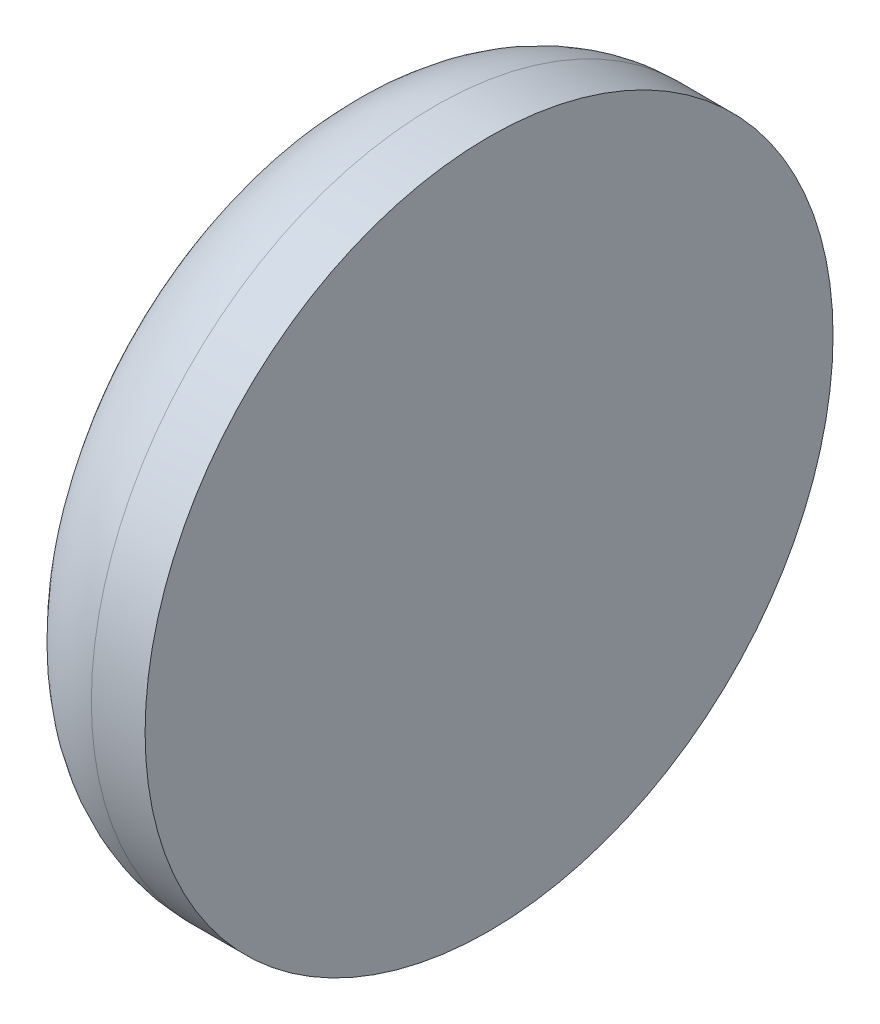
ISO-10303-21;
HEADER;
FILE_DESCRIPTION(('STEP AP214'),'2;1');
FILE_NAME('part.step','',(''),(''),'','','');
FILE_SCHEMA(('AUTOMOTIVE_DESIGN { 1 0 10303 214 1 1 1 1 }'));
ENDSEC;
DATA;
#1=APPLICATION_CONTEXT('core data for automotive mechanical design processes');
#2=APPLICATION_PROTOCOL_DEFINITION('international standard','automotive_design',2000,#1);
#3=PRODUCT_CONTEXT('',#1,'mechanical');
#4=PRODUCT('Part','Part','',(#3));
#5=PRODUCT_RELATED_PRODUCT_CATEGORY('part','',(#4));
#6=PRODUCT_DEFINITION_FORMATION('','',#4);
#7=PRODUCT_DEFINITION_CONTEXT('part definition',#1,'design');
#8=PRODUCT_DEFINITION('design','',#6,#7);
#9=PRODUCT_DEFINITION_SHAPE('','',#8);
#10=(LENGTH_UNIT() NAMED_UNIT(*) SI_UNIT(.MILLI.,.METRE.));
#11=(NAMED_UNIT(*) PLANE_ANGLE_UNIT() SI_UNIT($,.RADIAN.));
#12=(NAMED_UNIT(*) SI_UNIT($,.STERADIAN.) SOLID_ANGLE_UNIT());
#13=UNCERTAINTY_MEASURE_WITH_UNIT(LENGTH_MEASURE(1.E-05),#10,'distance_accuracy_value','');
#14=(GEOMETRIC_REPRESENTATION_CONTEXT(3) GLOBAL_UNCERTAINTY_ASSIGNED_CONTEXT((#13)) GLOBAL_UNIT_ASSIGNED_CONTEXT((#10,
#11,#12)) REPRESENTATION_CONTEXT('',''));
#15=CARTESIAN_POINT('',(0.,0.,0.));
#16=DIRECTION('',(0.,0.,1.));
#17=DIRECTION('',(1.,0.,0.));
#18=AXIS2_PLACEMENT_3D('',#15,#16,#17);
#19=CARTESIAN_POINT('',(-144.5,0.,-151.25));
#20=DIRECTION('',(-1.,0.,0.));
#21=DIRECTION('',(0.,0.,1.));
#22=AXIS2_PLACEMENT_3D('',#19,#20,#21);
#23=PLANE('',#22);
#24=CARTESIAN_POINT('',(-144.5,46.,-112.25));
#25=DIRECTION('',(-1.,0.,0.));
#26=DIRECTION('',(0.,0.,-1.));
#27=AXIS2_PLACEMENT_3D('',#24,#25,#26);
#28=CIRCLE('',#27,3.2);
#29=CARTESIAN_POINT('',(-144.5,46.,-115.45));
#30=VERTEX_POINT('',#29);
#31=EDGE_CURVE('E26',#30,#30,#28,.T.);
#32=ORIENTED_EDGE('',*,*,#31,.F.);
#33=EDGE_LOOP('',(#32));
#34=FACE_BOUND('',#33,.T.);
#35=ADVANCED_FACE('F15',(#34),#23,.F.);
#36=CARTESIAN_POINT('',(-144.5,46.,-112.25));
#37=DIRECTION('',(-1.,0.,0.));
#38=DIRECTION('',(0.,0.,1.));
#39=AXIS2_PLACEMENT_3D('',#36,#37,#38);
#40=CYLINDRICAL_SURFACE('',#39,3.2);
#41=CARTESIAN_POINT('',(-145.,46.,-112.25));
#42=DIRECTION('',(-1.,0.,0.));
#43=DIRECTION('',(0.,0.,1.));
#44=AXIS2_PLACEMENT_3D('',#41,#42,#43);
#45=CIRCLE('',#44,3.2);
#46=CARTESIAN_POINT('',(-145.,46.,-109.05));
#47=VERTEX_POINT('',#46);
#48=EDGE_CURVE('E10',#47,#47,#45,.T.);
#49=ORIENTED_EDGE('',*,*,#48,.F.);
#50=EDGE_LOOP('',(#49));
#51=FACE_BOUND('',#50,.T.);
#52=ORIENTED_EDGE('',*,*,#31,.T.);
#53=EDGE_LOOP('',(#52));
#54=FACE_BOUND('',#53,.T.);
#55=ADVANCED_FACE('F31',(#51,#54),#40,.T.);
#56=CARTESIAN_POINT('',(-145.,46.,-112.25));
#57=DIRECTION('',(-1.,0.,0.));
#58=DIRECTION('',(0.,-0.246870869189102,0.969048385760906));
#59=AXIS2_PLACEMENT_3D('',#56,#57,#58);
#60=TOROIDAL_SURFACE('',#59,2.2,1.);
#61=ORIENTED_EDGE('',*,*,#48,.T.);
#62=EDGE_LOOP('',(#61));
#63=FACE_BOUND('',#62,.T.);
#64=CARTESIAN_POINT('',(-146.,46.,-112.25));
#65=DIRECTION('',(-1.,0.,0.));
#66=DIRECTION('',(0.,0.,1.));
#67=AXIS2_PLACEMENT_3D('',#64,#65,#66);
#68=CIRCLE('',#67,2.2);
#69=CARTESIAN_POINT('',(-146.,46.,-110.05));
#70=VERTEX_POINT('',#69);
#71=EDGE_CURVE('E19',#70,#70,#68,.T.);
#72=ORIENTED_EDGE('',*,*,#71,.F.);
#73=EDGE_LOOP('',(#72));
#74=FACE_BOUND('',#73,.T.);
#75=ADVANCED_FACE('F39',(#63,#74),#60,.T.);
#76=CARTESIAN_POINT('',(-146.,0.,-151.25));
#77=DIRECTION('',(-1.,0.,0.));
#78=DIRECTION('',(0.,0.,1.));
#79=AXIS2_PLACEMENT_3D('',#76,#77,#78);
#80=PLANE('',#79);
#81=ORIENTED_EDGE('',*,*,#71,.T.);
#82=EDGE_LOOP('',(#81));
#83=FACE_BOUND('',#82,.T.);
#84=ADVANCED_FACE('F17',(#83),#80,.T.);
#85=CLOSED_SHELL('',(#35,#55,#75,#84));
#86=MANIFOLD_SOLID_BREP('B1',#85);
#87=ADVANCED_BREP_SHAPE_REPRESENTATION('',(#18,#86),#14);
#88=SHAPE_DEFINITION_REPRESENTATION(#9,#87);
ENDSEC;
END-ISO-10303-21;
